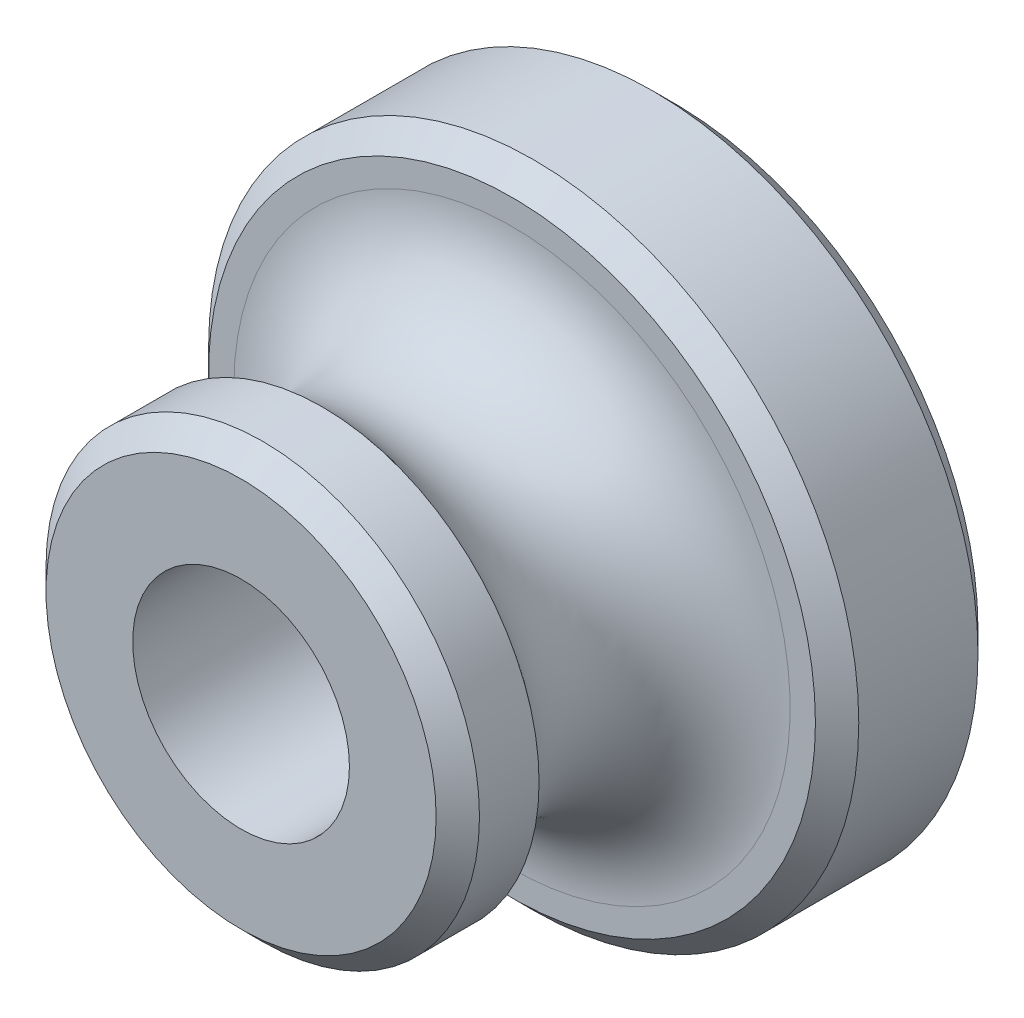
ISO-10303-21;
HEADER;
FILE_DESCRIPTION(('STEP AP214'),'2;1');
FILE_NAME('part.step','',(''),(''),'','','');
FILE_SCHEMA(('AUTOMOTIVE_DESIGN { 1 0 10303 214 1 1 1 1 }'));
ENDSEC;
DATA;
#1=APPLICATION_CONTEXT('core data for automotive mechanical design processes');
#2=APPLICATION_PROTOCOL_DEFINITION('international standard','automotive_design',2000,#1);
#3=PRODUCT_CONTEXT('',#1,'mechanical');
#4=PRODUCT('Part','Part','',(#3));
#5=PRODUCT_RELATED_PRODUCT_CATEGORY('part','',(#4));
#6=PRODUCT_DEFINITION_FORMATION('','',#4);
#7=PRODUCT_DEFINITION_CONTEXT('part definition',#1,'design');
#8=PRODUCT_DEFINITION('design','',#6,#7);
#9=PRODUCT_DEFINITION_SHAPE('','',#8);
#10=(LENGTH_UNIT() NAMED_UNIT(*) SI_UNIT(.MILLI.,.METRE.));
#11=(NAMED_UNIT(*) PLANE_ANGLE_UNIT() SI_UNIT($,.RADIAN.));
#12=(NAMED_UNIT(*) SI_UNIT($,.STERADIAN.) SOLID_ANGLE_UNIT());
#13=UNCERTAINTY_MEASURE_WITH_UNIT(LENGTH_MEASURE(1.E-05),#10,'distance_accuracy_value','');
#14=(GEOMETRIC_REPRESENTATION_CONTEXT(3) GLOBAL_UNCERTAINTY_ASSIGNED_CONTEXT((#13)) GLOBAL_UNIT_ASSIGNED_CONTEXT((#10,
#11,#12)) REPRESENTATION_CONTEXT('',''));
#15=CARTESIAN_POINT('',(0.,0.,0.));
#16=DIRECTION('',(0.,0.,1.));
#17=DIRECTION('',(1.,0.,0.));
#18=AXIS2_PLACEMENT_3D('',#15,#16,#17);
#19=CARTESIAN_POINT('',(51.9999988026106,2.99999999999495,-18.095998851776));
#20=DIRECTION('',(0.,2.55698240358981E-13,1.));
#21=DIRECTION('',(-1.,0.,0.));
#22=AXIS2_PLACEMENT_3D('',#19,#20,#21);
#23=CYLINDRICAL_SURFACE('',#22,2.);
#24=CARTESIAN_POINT('',(51.9999988026106,2.999999999997,-10.095998851776));
#25=DIRECTION('',(0.,-2.556888703492E-13,-1.));
#26=DIRECTION('',(-1.,0.,0.));
#27=AXIS2_PLACEMENT_3D('',#24,#25,#26);
#28=CIRCLE('',#27,2.);
#29=CARTESIAN_POINT('',(53.9999988026106,2.999999999997,-10.095998851776));
#30=VERTEX_POINT('',#29);
#31=EDGE_CURVE('E126',#30,#30,#28,.T.);
#32=ORIENTED_EDGE('',*,*,#31,.F.);
#33=DIRECTION('',(0.,-2.55698240358981E-13,-1.));
#34=VECTOR('',#33,1.);
#35=CARTESIAN_POINT('',(53.9999988026106,2.99999999999495,-18.095998851776));
#36=LINE('',#35,#34);
#37=CARTESIAN_POINT('',(53.9999988026106,2.99999999999495,-18.095998851776));
#38=VERTEX_POINT('',#37);
#39=EDGE_CURVE('E11',#30,#38,#36,.T.);
#40=ORIENTED_EDGE('',*,*,#39,.T.);
#41=CARTESIAN_POINT('',(51.9999988026106,2.99999999999495,-18.095998851776));
#42=DIRECTION('',(0.,2.556888703492E-13,1.));
#43=DIRECTION('',(-1.,0.,0.));
#44=AXIS2_PLACEMENT_3D('',#41,#42,#43);
#45=CIRCLE('',#44,2.);
#46=EDGE_CURVE('E106',#38,#38,#45,.T.);
#47=ORIENTED_EDGE('',*,*,#46,.F.);
#48=ORIENTED_EDGE('',*,*,#39,.F.);
#49=EDGE_LOOP('',(#32,#40,#47,#48));
#50=FACE_BOUND('',#49,.T.);
#51=ADVANCED_FACE('F17',(#50),#23,.F.);
#52=CARTESIAN_POINT('',(51.9999988026106,2.99999999999622,-13.1624307650158));
#53=DIRECTION('',(0.,0.,1.));
#54=DIRECTION('',(1.,0.,0.));
#55=AXIS2_PLACEMENT_3D('',#52,#53,#54);
#56=TOROIDAL_SURFACE('',#55,5.13356808676014,1.93356808676014);
#57=CARTESIAN_POINT('',(51.9999988026106,2.99999999999662,-11.595998851776));
#58=DIRECTION('',(0.,2.55684362571174E-13,1.));
#59=DIRECTION('',(-1.,0.,0.));
#60=AXIS2_PLACEMENT_3D('',#57,#58,#59);
#61=CIRCLE('',#60,4.);
#62=CARTESIAN_POINT('',(55.9999988026106,2.99999999999598,-11.595998851776));
#63=VERTEX_POINT('',#62);
#64=CARTESIAN_POINT('',(47.9999988026106,2.99999999999622,-11.595998851776));
#65=VERTEX_POINT('',#64);
#66=EDGE_CURVE('E137',#63,#65,#61,.T.);
#67=ORIENTED_EDGE('',*,*,#66,.F.);
#68=CARTESIAN_POINT('',(51.9999988026106,2.99999999999662,-11.595998851776));
#69=DIRECTION('',(0.,2.55684362571174E-13,1.));
#70=DIRECTION('',(-1.,0.,0.));
#71=AXIS2_PLACEMENT_3D('',#68,#69,#70);
#72=CIRCLE('',#71,4.);
#73=EDGE_CURVE('E129',#65,#63,#72,.T.);
#74=ORIENTED_EDGE('',*,*,#73,.F.);
#75=CARTESIAN_POINT('',(46.8664307158504,2.99999999999621,-13.1624307650158));
#76=DIRECTION('',(0.,1.,0.));
#77=DIRECTION('',(-1.,0.,0.));
#78=AXIS2_PLACEMENT_3D('',#75,#76,#77);
#79=CIRCLE('',#78,1.93356808676014);
#80=CARTESIAN_POINT('',(46.8664307158504,2.99999999999597,-15.095998851776));
#81=VERTEX_POINT('',#80);
#82=EDGE_CURVE('E28',#65,#81,#79,.T.);
#83=ORIENTED_EDGE('',*,*,#82,.T.);
#84=CARTESIAN_POINT('',(51.9999988026106,2.99999999999597,-15.095998851776));
#85=DIRECTION('',(0.,1.278444351746E-13,1.));
#86=DIRECTION('',(1.,0.,0.));
#87=AXIS2_PLACEMENT_3D('',#84,#85,#86);
#88=CIRCLE('',#87,5.13356808676014);
#89=EDGE_CURVE('E96',#81,#81,#88,.T.);
#90=ORIENTED_EDGE('',*,*,#89,.T.);
#91=ORIENTED_EDGE('',*,*,#82,.F.);
#92=EDGE_LOOP('',(#67,#74,#83,#90,#91));
#93=FACE_BOUND('',#92,.T.);
#94=ADVANCED_FACE('F170',(#93),#56,.F.);
#95=CARTESIAN_POINT('',(51.9999988026106,2.999999999997,-10.095998851776));
#96=DIRECTION('',(0.,2.556888703492E-13,1.));
#97=DIRECTION('',(0.,-1.,2.556888703492E-13));
#98=AXIS2_PLACEMENT_3D('',#95,#96,#97);
#99=PLANE('',#98);
#100=ORIENTED_EDGE('',*,*,#31,.T.);
#101=EDGE_LOOP('',(#100));
#102=FACE_BOUND('',#101,.T.);
#103=CARTESIAN_POINT('',(51.9999988026106,2.999999999997,-10.095998851776));
#104=DIRECTION('',(0.,-2.556888703492E-13,-1.));
#105=DIRECTION('',(-1.,0.,0.));
#106=AXIS2_PLACEMENT_3D('',#103,#104,#105);
#107=CIRCLE('',#106,3.6);
#108=CARTESIAN_POINT('',(55.5999988026106,2.999999999997,-10.095998851776));
#109=VERTEX_POINT('',#108);
#110=EDGE_CURVE('E104',#109,#109,#107,.T.);
#111=ORIENTED_EDGE('',*,*,#110,.F.);
#112=EDGE_LOOP('',(#111));
#113=FACE_BOUND('',#112,.T.);
#114=ADVANCED_FACE('F174',(#102,#113),#99,.T.);
#115=CARTESIAN_POINT('',(51.9999988026106,2.999999999997,-10.095998851776));
#116=DIRECTION('',(0.,-2.55684362571174E-13,-1.));
#117=DIRECTION('',(-1.,0.,0.));
#118=AXIS2_PLACEMENT_3D('',#115,#116,#117);
#119=CYLINDRICAL_SURFACE('',#118,4.);
#120=CARTESIAN_POINT('',(51.9999988026106,2.9999999999969,-10.495998851776));
#121=DIRECTION('',(0.,2.556888703492E-13,1.));
#122=DIRECTION('',(-1.,0.,0.));
#123=AXIS2_PLACEMENT_3D('',#120,#121,#122);
#124=CIRCLE('',#123,4.);
#125=CARTESIAN_POINT('',(55.9999988026106,2.9999999999969,-10.495998851776));
#126=VERTEX_POINT('',#125);
#127=EDGE_CURVE('E108',#126,#126,#124,.T.);
#128=ORIENTED_EDGE('',*,*,#127,.F.);
#129=DIRECTION('',(0.,-2.55684362571174E-13,-1.));
#130=VECTOR('',#129,1.);
#131=CARTESIAN_POINT('',(55.9999988026106,2.999999999997,-10.095998851776));
#132=LINE('',#131,#130);
#133=EDGE_CURVE('E82',#126,#63,#132,.T.);
#134=ORIENTED_EDGE('',*,*,#133,.T.);
#135=ORIENTED_EDGE('',*,*,#66,.T.);
#136=ORIENTED_EDGE('',*,*,#73,.T.);
#137=ORIENTED_EDGE('',*,*,#133,.F.);
#138=EDGE_LOOP('',(#128,#134,#135,#136,#137));
#139=FACE_BOUND('',#138,.T.);
#140=ADVANCED_FACE('F180',(#139),#119,.T.);
#141=CARTESIAN_POINT('',(51.9999988026106,2.99999999999695,-10.295998851776));
#142=DIRECTION('',(0.,-2.55351295663786E-13,-1.));
#143=DIRECTION('',(-1.,0.,0.));
#144=AXIS2_PLACEMENT_3D('',#141,#142,#143);
#145=CONICAL_SURFACE('',#144,3.8,0.785398163397448);
#146=ORIENTED_EDGE('',*,*,#110,.T.);
#147=DIRECTION('',(0.707106781186548,-1.8047403714301E-13,-0.707106781186548));
#148=VECTOR('',#147,1.);
#149=CARTESIAN_POINT('',(55.7999988026106,2.99999999999695,-10.295998851776));
#150=LINE('',#149,#148);
#151=EDGE_CURVE('E72',#109,#126,#150,.T.);
#152=ORIENTED_EDGE('',*,*,#151,.T.);
#153=ORIENTED_EDGE('',*,*,#127,.T.);
#154=ORIENTED_EDGE('',*,*,#151,.F.);
#155=EDGE_LOOP('',(#146,#152,#153,#154));
#156=FACE_BOUND('',#155,.T.);
#157=ADVANCED_FACE('F182',(#156),#145,.T.);
#158=CARTESIAN_POINT('',(51.9999988026106,2.99999999999572,-15.095998851776));
#159=DIRECTION('',(0.,2.556888703492E-13,1.));
#160=DIRECTION('',(0.,-1.,2.556888703492E-13));
#161=AXIS2_PLACEMENT_3D('',#158,#159,#160);
#162=PLANE('',#161);
#163=ORIENTED_EDGE('',*,*,#89,.F.);
#164=EDGE_LOOP('',(#163));
#165=FACE_BOUND('',#164,.T.);
#166=CARTESIAN_POINT('',(51.9999988026106,2.99999999999572,-15.095998851776));
#167=DIRECTION('',(0.,-2.556888703492E-13,-1.));
#168=DIRECTION('',(-1.,0.,0.));
#169=AXIS2_PLACEMENT_3D('',#166,#167,#168);
#170=CIRCLE('',#169,5.6);
#171=CARTESIAN_POINT('',(57.5999988026106,2.99999999999572,-15.095998851776));
#172=VERTEX_POINT('',#171);
#173=EDGE_CURVE('E90',#172,#172,#170,.T.);
#174=ORIENTED_EDGE('',*,*,#173,.F.);
#175=EDGE_LOOP('',(#174));
#176=FACE_BOUND('',#175,.T.);
#177=ADVANCED_FACE('F179',(#165,#176),#162,.T.);
#178=CARTESIAN_POINT('',(51.9999988026106,2.99999999999567,-15.295998851776));
#179=DIRECTION('',(0.,-2.55351295663786E-13,-1.));
#180=DIRECTION('',(-1.,0.,0.));
#181=AXIS2_PLACEMENT_3D('',#178,#179,#180);
#182=CONICAL_SURFACE('',#181,5.8,0.785398163397448);
#183=CARTESIAN_POINT('',(51.9999988026106,2.99999999999562,-15.495998851776));
#184=DIRECTION('',(0.,2.556888703492E-13,1.));
#185=DIRECTION('',(-1.,0.,0.));
#186=AXIS2_PLACEMENT_3D('',#183,#184,#185);
#187=CIRCLE('',#186,6.);
#188=CARTESIAN_POINT('',(57.9999988026106,2.99999999999562,-15.495998851776));
#189=VERTEX_POINT('',#188);
#190=EDGE_CURVE('E114',#189,#189,#187,.T.);
#191=ORIENTED_EDGE('',*,*,#190,.T.);
#192=DIRECTION('',(-0.707106781186548,1.806472282971E-13,0.707106781186548));
#193=VECTOR('',#192,1.);
#194=CARTESIAN_POINT('',(57.7999988026106,2.99999999999567,-15.295998851776));
#195=LINE('',#194,#193);
#196=EDGE_CURVE('E21',#189,#172,#195,.T.);
#197=ORIENTED_EDGE('',*,*,#196,.T.);
#198=ORIENTED_EDGE('',*,*,#173,.T.);
#199=ORIENTED_EDGE('',*,*,#196,.F.);
#200=EDGE_LOOP('',(#191,#197,#198,#199));
#201=FACE_BOUND('',#200,.T.);
#202=ADVANCED_FACE('F92',(#201),#182,.T.);
#203=CARTESIAN_POINT('',(51.9999988026106,2.99999999999495,-18.095998851776));
#204=DIRECTION('',(0.,2.556888703492E-13,1.));
#205=DIRECTION('',(0.,-1.,2.556888703492E-13));
#206=AXIS2_PLACEMENT_3D('',#203,#204,#205);
#207=PLANE('',#206);
#208=ORIENTED_EDGE('',*,*,#46,.T.);
#209=EDGE_LOOP('',(#208));
#210=FACE_BOUND('',#209,.T.);
#211=CARTESIAN_POINT('',(51.9999988026106,2.99999999999495,-18.095998851776));
#212=DIRECTION('',(0.,2.556888703492E-13,1.));
#213=DIRECTION('',(-1.,0.,0.));
#214=AXIS2_PLACEMENT_3D('',#211,#212,#213);
#215=CIRCLE('',#214,5.6);
#216=CARTESIAN_POINT('',(57.5999988026106,2.99999999999495,-18.095998851776));
#217=VERTEX_POINT('',#216);
#218=EDGE_CURVE('E111',#217,#217,#215,.T.);
#219=ORIENTED_EDGE('',*,*,#218,.F.);
#220=EDGE_LOOP('',(#219));
#221=FACE_BOUND('',#220,.T.);
#222=ADVANCED_FACE('F158',(#210,#221),#207,.F.);
#223=CARTESIAN_POINT('',(51.9999988026106,2.99999999999495,-18.095998851776));
#224=DIRECTION('',(0.,2.55698240358981E-13,1.));
#225=DIRECTION('',(-1.,0.,0.));
#226=AXIS2_PLACEMENT_3D('',#223,#224,#225);
#227=CYLINDRICAL_SURFACE('',#226,6.);
#228=ORIENTED_EDGE('',*,*,#190,.F.);
#229=DIRECTION('',(0.,-2.55698240358981E-13,-1.));
#230=VECTOR('',#229,1.);
#231=CARTESIAN_POINT('',(57.9999988026106,2.99999999999495,-18.095998851776));
#232=LINE('',#231,#230);
#233=CARTESIAN_POINT('',(57.9999988026106,2.99999999999506,-17.695998851776));
#234=VERTEX_POINT('',#233);
#235=EDGE_CURVE('E116',#189,#234,#232,.T.);
#236=ORIENTED_EDGE('',*,*,#235,.T.);
#237=CARTESIAN_POINT('',(51.9999988026106,2.99999999999506,-17.695998851776));
#238=DIRECTION('',(0.,-2.556888703492E-13,-1.));
#239=DIRECTION('',(-1.,0.,0.));
#240=AXIS2_PLACEMENT_3D('',#237,#238,#239);
#241=CIRCLE('',#240,6.);
#242=EDGE_CURVE('E120',#234,#234,#241,.T.);
#243=ORIENTED_EDGE('',*,*,#242,.F.);
#244=ORIENTED_EDGE('',*,*,#235,.F.);
#245=EDGE_LOOP('',(#228,#236,#243,#244));
#246=FACE_BOUND('',#245,.T.);
#247=ADVANCED_FACE('F156',(#246),#227,.T.);
#248=CARTESIAN_POINT('',(51.9999988026106,2.999999999995,-17.895998851776));
#249=DIRECTION('',(0.,2.55351295663786E-13,1.));
#250=DIRECTION('',(-1.,0.,0.));
#251=AXIS2_PLACEMENT_3D('',#248,#249,#250);
#252=CONICAL_SURFACE('',#251,5.8,0.785398163397448);
#253=ORIENTED_EDGE('',*,*,#242,.T.);
#254=DIRECTION('',(-0.707106781186548,-1.80647228411415E-13,-0.707106781186548));
#255=VECTOR('',#254,1.);
#256=CARTESIAN_POINT('',(57.7999988026106,2.999999999995,-17.895998851776));
#257=LINE('',#256,#255);
#258=EDGE_CURVE('E115',#234,#217,#257,.T.);
#259=ORIENTED_EDGE('',*,*,#258,.T.);
#260=ORIENTED_EDGE('',*,*,#218,.T.);
#261=ORIENTED_EDGE('',*,*,#258,.F.);
#262=EDGE_LOOP('',(#253,#259,#260,#261));
#263=FACE_BOUND('',#262,.T.);
#264=ADVANCED_FACE('F19',(#263),#252,.T.);
#265=CLOSED_SHELL('',(#51,#94,#114,#140,#157,#177,#202,#222,#247,#264));
#266=MANIFOLD_SOLID_BREP('B1',#265);
#267=ADVANCED_BREP_SHAPE_REPRESENTATION('',(#18,#266),#14);
#268=SHAPE_DEFINITION_REPRESENTATION(#9,#267);
ENDSEC;
END-ISO-10303-21;
